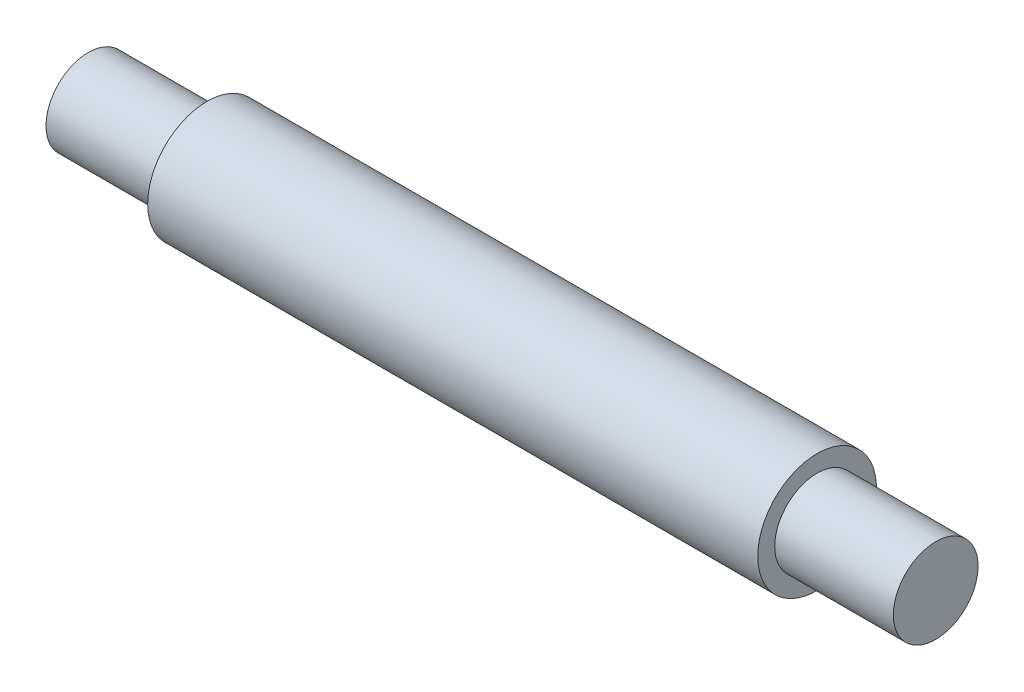
ISO-10303-21;
HEADER;
FILE_DESCRIPTION(('STEP AP214'),'2;1');
FILE_NAME('part.step','',(''),(''),'','','');
FILE_SCHEMA(('AUTOMOTIVE_DESIGN { 1 0 10303 214 1 1 1 1 }'));
ENDSEC;
DATA;
#1=APPLICATION_CONTEXT('core data for automotive mechanical design processes');
#2=APPLICATION_PROTOCOL_DEFINITION('international standard','automotive_design',2000,#1);
#3=PRODUCT_CONTEXT('',#1,'mechanical');
#4=PRODUCT('Part','Part','',(#3));
#5=PRODUCT_RELATED_PRODUCT_CATEGORY('part','',(#4));
#6=PRODUCT_DEFINITION_FORMATION('','',#4);
#7=PRODUCT_DEFINITION_CONTEXT('part definition',#1,'design');
#8=PRODUCT_DEFINITION('design','',#6,#7);
#9=PRODUCT_DEFINITION_SHAPE('','',#8);
#10=(LENGTH_UNIT() NAMED_UNIT(*) SI_UNIT(.MILLI.,.METRE.));
#11=(NAMED_UNIT(*) PLANE_ANGLE_UNIT() SI_UNIT($,.RADIAN.));
#12=(NAMED_UNIT(*) SI_UNIT($,.STERADIAN.) SOLID_ANGLE_UNIT());
#13=UNCERTAINTY_MEASURE_WITH_UNIT(LENGTH_MEASURE(1.E-05),#10,'distance_accuracy_value','');
#14=(GEOMETRIC_REPRESENTATION_CONTEXT(3) GLOBAL_UNCERTAINTY_ASSIGNED_CONTEXT((#13)) GLOBAL_UNIT_ASSIGNED_CONTEXT((#10,
#11,#12)) REPRESENTATION_CONTEXT('',''));
#15=CARTESIAN_POINT('',(0.,0.,0.));
#16=DIRECTION('',(0.,0.,1.));
#17=DIRECTION('',(1.,0.,0.));
#18=AXIS2_PLACEMENT_3D('',#15,#16,#17);
#19=CARTESIAN_POINT('',(40.,0.,-0.500000000000001));
#20=DIRECTION('',(1.,0.,0.));
#21=DIRECTION('',(0.,0.,-1.));
#22=AXIS2_PLACEMENT_3D('',#19,#20,#21);
#23=PLANE('',#22);
#24=CARTESIAN_POINT('',(40.,0.,-4.));
#25=DIRECTION('',(-1.,0.,0.));
#26=DIRECTION('',(0.,0.,1.));
#27=AXIS2_PLACEMENT_3D('',#24,#25,#26);
#28=CIRCLE('',#27,2.5);
#29=CARTESIAN_POINT('',(40.,0.,-1.5));
#30=VERTEX_POINT('',#29);
#31=EDGE_CURVE('E10',#30,#30,#28,.T.);
#32=ORIENTED_EDGE('',*,*,#31,.T.);
#33=EDGE_LOOP('',(#32));
#34=FACE_BOUND('',#33,.T.);
#35=CARTESIAN_POINT('',(40.,0.,-4.));
#36=DIRECTION('',(-1.,0.,0.));
#37=DIRECTION('',(0.,0.,1.));
#38=AXIS2_PLACEMENT_3D('',#35,#36,#37);
#39=CIRCLE('',#38,3.5);
#40=CARTESIAN_POINT('',(40.,0.,-0.500000000000001));
#41=VERTEX_POINT('',#40);
#42=EDGE_CURVE('E53',#41,#41,#39,.T.);
#43=ORIENTED_EDGE('',*,*,#42,.F.);
#44=EDGE_LOOP('',(#43));
#45=FACE_BOUND('',#44,.T.);
#46=ADVANCED_FACE('F31',(#34,#45),#23,.T.);
#47=CARTESIAN_POINT('',(-3.,0.,-4.));
#48=DIRECTION('',(-1.,0.,0.));
#49=DIRECTION('',(0.,0.,1.));
#50=AXIS2_PLACEMENT_3D('',#47,#48,#49);
#51=CYLINDRICAL_SURFACE('',#50,2.5);
#52=CARTESIAN_POINT('',(47.,0.,-4.));
#53=DIRECTION('',(-1.,0.,0.));
#54=DIRECTION('',(0.,0.,1.));
#55=AXIS2_PLACEMENT_3D('',#52,#53,#54);
#56=CIRCLE('',#55,2.5);
#57=CARTESIAN_POINT('',(47.,0.,-1.5));
#58=VERTEX_POINT('',#57);
#59=EDGE_CURVE('E37',#58,#58,#56,.T.);
#60=ORIENTED_EDGE('',*,*,#59,.T.);
#61=EDGE_LOOP('',(#60));
#62=FACE_BOUND('',#61,.T.);
#63=ORIENTED_EDGE('',*,*,#31,.F.);
#64=EDGE_LOOP('',(#63));
#65=FACE_BOUND('',#64,.T.);
#66=ADVANCED_FACE('F61',(#62,#65),#51,.T.);
#67=CARTESIAN_POINT('',(47.,0.,-1.5));
#68=DIRECTION('',(1.,0.,0.));
#69=DIRECTION('',(0.,0.,-1.));
#70=AXIS2_PLACEMENT_3D('',#67,#68,#69);
#71=PLANE('',#70);
#72=ORIENTED_EDGE('',*,*,#59,.F.);
#73=EDGE_LOOP('',(#72));
#74=FACE_BOUND('',#73,.T.);
#75=ADVANCED_FACE('F65',(#74),#71,.T.);
#76=CARTESIAN_POINT('',(-3.,0.,-1.5));
#77=DIRECTION('',(-1.,0.,0.));
#78=DIRECTION('',(0.,0.,1.));
#79=AXIS2_PLACEMENT_3D('',#76,#77,#78);
#80=PLANE('',#79);
#81=CARTESIAN_POINT('',(-3.,0.,-4.));
#82=DIRECTION('',(-1.,0.,0.));
#83=DIRECTION('',(0.,0.,1.));
#84=AXIS2_PLACEMENT_3D('',#81,#82,#83);
#85=CIRCLE('',#84,2.5);
#86=CARTESIAN_POINT('',(-3.,0.,-1.5));
#87=VERTEX_POINT('',#86);
#88=EDGE_CURVE('E41',#87,#87,#85,.T.);
#89=ORIENTED_EDGE('',*,*,#88,.T.);
#90=EDGE_LOOP('',(#89));
#91=FACE_BOUND('',#90,.T.);
#92=ADVANCED_FACE('F69',(#91),#80,.T.);
#93=CARTESIAN_POINT('',(-3.,0.,-4.));
#94=DIRECTION('',(-1.,0.,0.));
#95=DIRECTION('',(0.,0.,1.));
#96=AXIS2_PLACEMENT_3D('',#93,#94,#95);
#97=CYLINDRICAL_SURFACE('',#96,2.5);
#98=CARTESIAN_POINT('',(4.,0.,-4.));
#99=DIRECTION('',(-1.,0.,0.));
#100=DIRECTION('',(0.,0.,1.));
#101=AXIS2_PLACEMENT_3D('',#98,#99,#100);
#102=CIRCLE('',#101,2.5);
#103=CARTESIAN_POINT('',(4.,0.,-1.5));
#104=VERTEX_POINT('',#103);
#105=EDGE_CURVE('E45',#104,#104,#102,.T.);
#106=ORIENTED_EDGE('',*,*,#105,.T.);
#107=EDGE_LOOP('',(#106));
#108=FACE_BOUND('',#107,.T.);
#109=ORIENTED_EDGE('',*,*,#88,.F.);
#110=EDGE_LOOP('',(#109));
#111=FACE_BOUND('',#110,.T.);
#112=ADVANCED_FACE('F76',(#108,#111),#97,.T.);
#113=CARTESIAN_POINT('',(4.,0.,-1.5));
#114=DIRECTION('',(-1.,0.,0.));
#115=DIRECTION('',(0.,0.,1.));
#116=AXIS2_PLACEMENT_3D('',#113,#114,#115);
#117=PLANE('',#116);
#118=CARTESIAN_POINT('',(4.,0.,-4.));
#119=DIRECTION('',(-1.,0.,0.));
#120=DIRECTION('',(0.,0.,1.));
#121=AXIS2_PLACEMENT_3D('',#118,#119,#120);
#122=CIRCLE('',#121,3.5);
#123=CARTESIAN_POINT('',(4.,0.,-0.500000000000001));
#124=VERTEX_POINT('',#123);
#125=EDGE_CURVE('E50',#124,#124,#122,.T.);
#126=ORIENTED_EDGE('',*,*,#125,.T.);
#127=EDGE_LOOP('',(#126));
#128=FACE_BOUND('',#127,.T.);
#129=ORIENTED_EDGE('',*,*,#105,.F.);
#130=EDGE_LOOP('',(#129));
#131=FACE_BOUND('',#130,.T.);
#132=ADVANCED_FACE('F80',(#128,#131),#117,.T.);
#133=CARTESIAN_POINT('',(-3.,0.,-4.));
#134=DIRECTION('',(-1.,0.,0.));
#135=DIRECTION('',(0.,0.,1.));
#136=AXIS2_PLACEMENT_3D('',#133,#134,#135);
#137=CYLINDRICAL_SURFACE('',#136,3.5);
#138=ORIENTED_EDGE('',*,*,#42,.T.);
#139=EDGE_LOOP('',(#138));
#140=FACE_BOUND('',#139,.T.);
#141=ORIENTED_EDGE('',*,*,#125,.F.);
#142=EDGE_LOOP('',(#141));
#143=FACE_BOUND('',#142,.T.);
#144=ADVANCED_FACE('F57',(#140,#143),#137,.T.);
#145=CLOSED_SHELL('',(#46,#66,#75,#92,#112,#132,#144));
#146=MANIFOLD_SOLID_BREP('B2',#145);
#147=ADVANCED_BREP_SHAPE_REPRESENTATION('',(#18,#146),#14);
#148=SHAPE_DEFINITION_REPRESENTATION(#9,#147);
ENDSEC;
END-ISO-10303-21;
